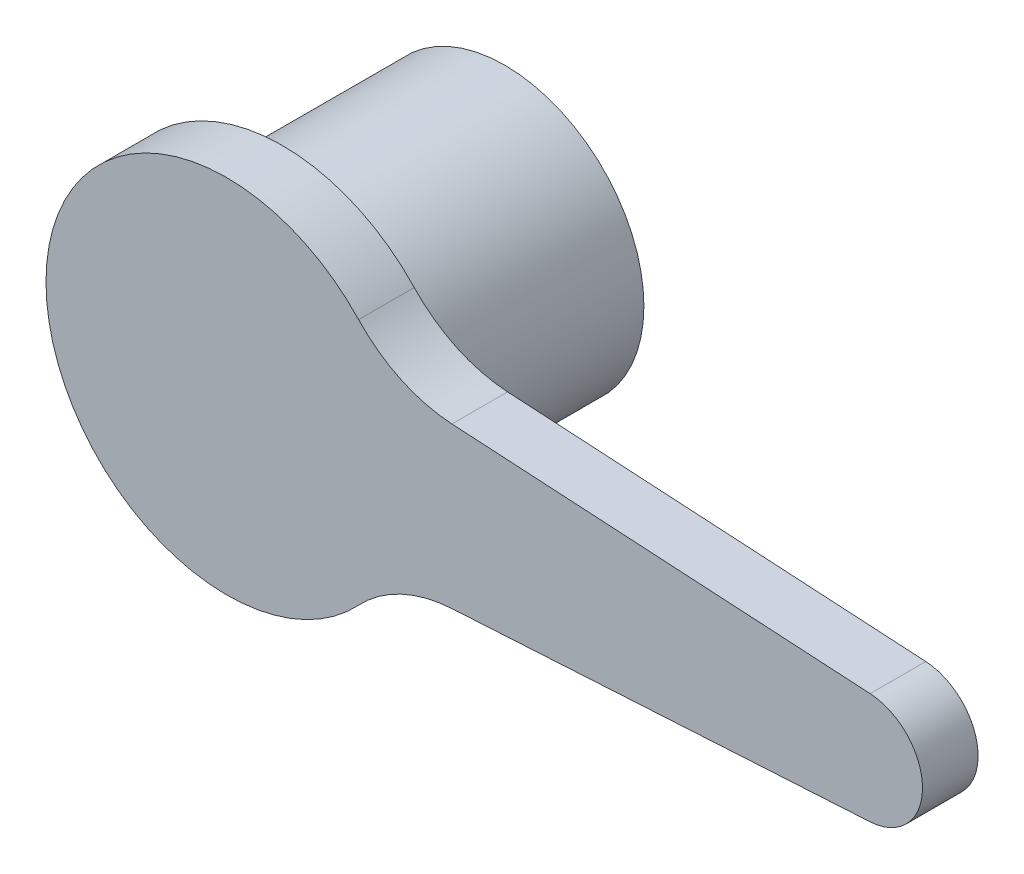
ISO-10303-21;
HEADER;
FILE_DESCRIPTION(('STEP AP214'),'2;1');
FILE_NAME('part.step','',(''),(''),'','','');
FILE_SCHEMA(('AUTOMOTIVE_DESIGN { 1 0 10303 214 1 1 1 1 }'));
ENDSEC;
DATA;
#1=APPLICATION_CONTEXT('core data for automotive mechanical design processes');
#2=APPLICATION_PROTOCOL_DEFINITION('international standard','automotive_design',2000,#1);
#3=PRODUCT_CONTEXT('',#1,'mechanical');
#4=PRODUCT('Part','Part','',(#3));
#5=PRODUCT_RELATED_PRODUCT_CATEGORY('part','',(#4));
#6=PRODUCT_DEFINITION_FORMATION('','',#4);
#7=PRODUCT_DEFINITION_CONTEXT('part definition',#1,'design');
#8=PRODUCT_DEFINITION('design','',#6,#7);
#9=PRODUCT_DEFINITION_SHAPE('','',#8);
#10=(LENGTH_UNIT() NAMED_UNIT(*) SI_UNIT(.MILLI.,.METRE.));
#11=(NAMED_UNIT(*) PLANE_ANGLE_UNIT() SI_UNIT($,.RADIAN.));
#12=(NAMED_UNIT(*) SI_UNIT($,.STERADIAN.) SOLID_ANGLE_UNIT());
#13=UNCERTAINTY_MEASURE_WITH_UNIT(LENGTH_MEASURE(1.E-05),#10,'distance_accuracy_value','');
#14=(GEOMETRIC_REPRESENTATION_CONTEXT(3) GLOBAL_UNCERTAINTY_ASSIGNED_CONTEXT((#13)) GLOBAL_UNIT_ASSIGNED_CONTEXT((#10,
#11,#12)) REPRESENTATION_CONTEXT('',''));
#15=CARTESIAN_POINT('',(0.,0.,0.));
#16=DIRECTION('',(0.,0.,1.));
#17=DIRECTION('',(1.,0.,0.));
#18=AXIS2_PLACEMENT_3D('',#15,#16,#17);
#19=CARTESIAN_POINT('',(230.175921183542,0.,20.));
#20=DIRECTION('',(0.,0.,-1.));
#21=DIRECTION('',(-1.,0.,0.));
#22=AXIS2_PLACEMENT_3D('',#19,#20,#21);
#23=CYLINDRICAL_SURFACE('',#22,20.);
#24=CARTESIAN_POINT('',(230.175921183542,0.,0.));
#25=DIRECTION('',(0.,0.,1.));
#26=DIRECTION('',(1.,0.,0.));
#27=AXIS2_PLACEMENT_3D('',#24,#25,#26);
#28=CIRCLE('',#27,20.);
#29=CARTESIAN_POINT('',(231.342508240109,-19.9659478773098,0.));
#30=VERTEX_POINT('',#29);
#31=CARTESIAN_POINT('',(231.342508240109,19.9659478773098,0.));
#32=VERTEX_POINT('',#31);
#33=EDGE_CURVE('E262',#30,#32,#28,.T.);
#34=ORIENTED_EDGE('',*,*,#33,.T.);
#35=DIRECTION('',(0.,0.,-1.));
#36=VECTOR('',#35,1.);
#37=CARTESIAN_POINT('',(231.342508240109,19.9659478773098,20.));
#38=LINE('',#37,#36);
#39=CARTESIAN_POINT('',(231.342508240109,19.9659478773098,20.));
#40=VERTEX_POINT('',#39);
#41=EDGE_CURVE('E47',#40,#32,#38,.T.);
#42=ORIENTED_EDGE('',*,*,#41,.F.);
#43=CARTESIAN_POINT('',(230.175921183542,0.,20.));
#44=DIRECTION('',(0.,0.,1.));
#45=DIRECTION('',(1.,0.,0.));
#46=AXIS2_PLACEMENT_3D('',#43,#44,#45);
#47=CIRCLE('',#46,20.);
#48=CARTESIAN_POINT('',(231.342508240109,-19.9659478773098,20.));
#49=VERTEX_POINT('',#48);
#50=EDGE_CURVE('E271',#49,#40,#47,.T.);
#51=ORIENTED_EDGE('',*,*,#50,.F.);
#52=DIRECTION('',(0.,0.,-1.));
#53=VECTOR('',#52,1.);
#54=CARTESIAN_POINT('',(231.342508240109,-19.9659478773098,20.));
#55=LINE('',#54,#53);
#56=EDGE_CURVE('E291',#49,#30,#55,.T.);
#57=ORIENTED_EDGE('',*,*,#56,.T.);
#58=EDGE_LOOP('',(#34,#42,#51,#57));
#59=FACE_BOUND('',#58,.T.);
#60=ADVANCED_FACE('F39',(#59),#23,.T.);
#61=CARTESIAN_POINT('',(231.342508240109,19.9659478773098,20.));
#62=DIRECTION('',(-0.0583293528283373,-0.998297393865489,0.));
#63=DIRECTION('',(0.998297393865489,-0.0583293528283373,0.));
#64=AXIS2_PLACEMENT_3D('',#61,#62,#63);
#65=PLANE('',#64);
#66=DIRECTION('',(-0.998297393865489,0.0583293528283373,0.));
#67=VECTOR('',#66,1.);
#68=CARTESIAN_POINT('',(231.342508240109,19.9659478773098,0.));
#69=LINE('',#68,#67);
#70=CARTESIAN_POINT('',(80.9673397628192,28.7521936519975,0.));
#71=VERTEX_POINT('',#70);
#72=EDGE_CURVE('E295',#32,#71,#69,.T.);
#73=ORIENTED_EDGE('',*,*,#72,.T.);
#74=DIRECTION('',(0.,0.,-1.));
#75=VECTOR('',#74,1.);
#76=CARTESIAN_POINT('',(80.9673397628192,28.7521936519975,20.));
#77=LINE('',#76,#75);
#78=CARTESIAN_POINT('',(80.9673397628192,28.7521936519975,20.));
#79=VERTEX_POINT('',#78);
#80=EDGE_CURVE('E324',#79,#71,#77,.T.);
#81=ORIENTED_EDGE('',*,*,#80,.F.);
#82=DIRECTION('',(-0.998297393865489,0.0583293528283373,0.));
#83=VECTOR('',#82,1.);
#84=CARTESIAN_POINT('',(231.342508240109,19.9659478773098,20.));
#85=LINE('',#84,#83);
#86=EDGE_CURVE('E275',#40,#79,#85,.T.);
#87=ORIENTED_EDGE('',*,*,#86,.F.);
#88=ORIENTED_EDGE('',*,*,#41,.T.);
#89=EDGE_LOOP('',(#73,#81,#87,#88));
#90=FACE_BOUND('',#89,.T.);
#91=ADVANCED_FACE('F331',(#90),#65,.F.);
#92=CARTESIAN_POINT('',(83.883807404236,78.667063345272,20.));
#93=DIRECTION('',(0.,0.,-1.));
#94=DIRECTION('',(-1.,0.,0.));
#95=AXIS2_PLACEMENT_3D('',#92,#93,#94);
#96=CYLINDRICAL_SURFACE('',#95,50.);
#97=CARTESIAN_POINT('',(83.883807404236,78.667063345272,0.));
#98=DIRECTION('',(0.,0.,-1.));
#99=DIRECTION('',(-1.,0.,0.));
#100=AXIS2_PLACEMENT_3D('',#97,#98,#99);
#101=CIRCLE('',#100,50.);
#102=CARTESIAN_POINT('',(47.4125867936987,44.4639923255885,0.));
#103=VERTEX_POINT('',#102);
#104=EDGE_CURVE('E298',#71,#103,#101,.T.);
#105=ORIENTED_EDGE('',*,*,#104,.T.);
#106=DIRECTION('',(0.,0.,-1.));
#107=VECTOR('',#106,1.);
#108=CARTESIAN_POINT('',(47.4125867936987,44.4639923255885,20.));
#109=LINE('',#108,#107);
#110=CARTESIAN_POINT('',(47.4125867936987,44.4639923255885,20.));
#111=VERTEX_POINT('',#110);
#112=EDGE_CURVE('E320',#111,#103,#109,.T.);
#113=ORIENTED_EDGE('',*,*,#112,.F.);
#114=CARTESIAN_POINT('',(83.883807404236,78.667063345272,20.));
#115=DIRECTION('',(0.,0.,-1.));
#116=DIRECTION('',(-1.,0.,0.));
#117=AXIS2_PLACEMENT_3D('',#114,#115,#116);
#118=CIRCLE('',#117,50.);
#119=EDGE_CURVE('E279',#79,#111,#118,.T.);
#120=ORIENTED_EDGE('',*,*,#119,.F.);
#121=ORIENTED_EDGE('',*,*,#80,.T.);
#122=EDGE_LOOP('',(#105,#113,#120,#121));
#123=FACE_BOUND('',#122,.T.);
#124=ADVANCED_FACE('F345',(#123),#96,.F.);
#125=CARTESIAN_POINT('',(0.,0.,20.));
#126=DIRECTION('',(0.,0.,-1.));
#127=DIRECTION('',(-1.,0.,0.));
#128=AXIS2_PLACEMENT_3D('',#125,#126,#127);
#129=CYLINDRICAL_SURFACE('',#128,65.);
#130=CARTESIAN_POINT('',(0.,0.,0.));
#131=DIRECTION('',(0.,0.,1.));
#132=DIRECTION('',(1.,0.,0.));
#133=AXIS2_PLACEMENT_3D('',#130,#131,#132);
#134=CIRCLE('',#133,65.);
#135=CARTESIAN_POINT('',(47.4125867936986,-44.4639923255885,0.));
#136=VERTEX_POINT('',#135);
#137=EDGE_CURVE('E301',#103,#136,#134,.T.);
#138=ORIENTED_EDGE('',*,*,#137,.T.);
#139=DIRECTION('',(0.,0.,-1.));
#140=VECTOR('',#139,1.);
#141=CARTESIAN_POINT('',(47.4125867936986,-44.4639923255885,20.));
#142=LINE('',#141,#140);
#143=CARTESIAN_POINT('',(47.4125867936986,-44.4639923255885,20.));
#144=VERTEX_POINT('',#143);
#145=EDGE_CURVE('E316',#144,#136,#142,.T.);
#146=ORIENTED_EDGE('',*,*,#145,.F.);
#147=CARTESIAN_POINT('',(0.,0.,20.));
#148=DIRECTION('',(0.,0.,1.));
#149=DIRECTION('',(1.,0.,0.));
#150=AXIS2_PLACEMENT_3D('',#147,#148,#149);
#151=CIRCLE('',#150,65.);
#152=EDGE_CURVE('E282',#111,#144,#151,.T.);
#153=ORIENTED_EDGE('',*,*,#152,.F.);
#154=ORIENTED_EDGE('',*,*,#112,.T.);
#155=EDGE_LOOP('',(#138,#146,#153,#154));
#156=FACE_BOUND('',#155,.T.);
#157=ADVANCED_FACE('F349',(#156),#129,.T.);
#158=CARTESIAN_POINT('',(83.883807404236,-78.667063345272,20.));
#159=DIRECTION('',(0.,0.,-1.));
#160=DIRECTION('',(-1.,0.,0.));
#161=AXIS2_PLACEMENT_3D('',#158,#159,#160);
#162=CYLINDRICAL_SURFACE('',#161,50.);
#163=CARTESIAN_POINT('',(83.883807404236,-78.667063345272,0.));
#164=DIRECTION('',(0.,0.,-1.));
#165=DIRECTION('',(1.,0.,0.));
#166=AXIS2_PLACEMENT_3D('',#163,#164,#165);
#167=CIRCLE('',#166,50.);
#168=CARTESIAN_POINT('',(80.9673397628192,-28.7521936519975,0.));
#169=VERTEX_POINT('',#168);
#170=EDGE_CURVE('E304',#136,#169,#167,.T.);
#171=ORIENTED_EDGE('',*,*,#170,.T.);
#172=DIRECTION('',(0.,0.,-1.));
#173=VECTOR('',#172,1.);
#174=CARTESIAN_POINT('',(80.9673397628192,-28.7521936519975,20.));
#175=LINE('',#174,#173);
#176=CARTESIAN_POINT('',(80.9673397628192,-28.7521936519975,20.));
#177=VERTEX_POINT('',#176);
#178=EDGE_CURVE('E312',#177,#169,#175,.T.);
#179=ORIENTED_EDGE('',*,*,#178,.F.);
#180=CARTESIAN_POINT('',(83.883807404236,-78.667063345272,20.));
#181=DIRECTION('',(0.,0.,-1.));
#182=DIRECTION('',(1.,0.,0.));
#183=AXIS2_PLACEMENT_3D('',#180,#181,#182);
#184=CIRCLE('',#183,50.);
#185=EDGE_CURVE('E285',#144,#177,#184,.T.);
#186=ORIENTED_EDGE('',*,*,#185,.F.);
#187=ORIENTED_EDGE('',*,*,#145,.T.);
#188=EDGE_LOOP('',(#171,#179,#186,#187));
#189=FACE_BOUND('',#188,.T.);
#190=ADVANCED_FACE('F359',(#189),#162,.F.);
#191=CARTESIAN_POINT('',(231.342508240109,-19.9659478773098,20.));
#192=DIRECTION('',(-0.0583293528283373,0.998297393865489,0.));
#193=DIRECTION('',(-0.998297393865489,-0.0583293528283373,0.));
#194=AXIS2_PLACEMENT_3D('',#191,#192,#193);
#195=PLANE('',#194);
#196=DIRECTION('',(0.998297393865489,0.0583293528283373,0.));
#197=VECTOR('',#196,1.);
#198=CARTESIAN_POINT('',(231.342508240109,-19.9659478773098,0.));
#199=LINE('',#198,#197);
#200=EDGE_CURVE('E276',#169,#30,#199,.T.);
#201=ORIENTED_EDGE('',*,*,#200,.T.);
#202=ORIENTED_EDGE('',*,*,#56,.F.);
#203=DIRECTION('',(0.998297393865489,0.0583293528283373,0.));
#204=VECTOR('',#203,1.);
#205=CARTESIAN_POINT('',(231.342508240109,-19.9659478773098,20.));
#206=LINE('',#205,#204);
#207=EDGE_CURVE('E288',#177,#49,#206,.T.);
#208=ORIENTED_EDGE('',*,*,#207,.F.);
#209=ORIENTED_EDGE('',*,*,#178,.T.);
#210=EDGE_LOOP('',(#201,#202,#208,#209));
#211=FACE_BOUND('',#210,.T.);
#212=ADVANCED_FACE('F357',(#211),#195,.F.);
#213=CARTESIAN_POINT('',(230.175921183542,0.,20.));
#214=DIRECTION('',(0.,0.,1.));
#215=DIRECTION('',(1.,0.,0.));
#216=AXIS2_PLACEMENT_3D('',#213,#214,#215);
#217=PLANE('',#216);
#218=ORIENTED_EDGE('',*,*,#50,.T.);
#219=ORIENTED_EDGE('',*,*,#86,.T.);
#220=ORIENTED_EDGE('',*,*,#119,.T.);
#221=ORIENTED_EDGE('',*,*,#152,.T.);
#222=ORIENTED_EDGE('',*,*,#185,.T.);
#223=ORIENTED_EDGE('',*,*,#207,.T.);
#224=EDGE_LOOP('',(#218,#219,#220,#221,#222,#223));
#225=FACE_BOUND('',#224,.T.);
#226=ADVANCED_FACE('F353',(#225),#217,.T.);
#227=CARTESIAN_POINT('',(230.175921183542,0.,0.));
#228=DIRECTION('',(0.,0.,1.));
#229=DIRECTION('',(1.,0.,0.));
#230=AXIS2_PLACEMENT_3D('',#227,#228,#229);
#231=PLANE('',#230);
#232=CARTESIAN_POINT('',(0.,0.,0.));
#233=DIRECTION('',(0.,0.,1.));
#234=DIRECTION('',(1.,0.,0.));
#235=AXIS2_PLACEMENT_3D('',#232,#233,#234);
#236=CIRCLE('',#235,50.);
#237=CARTESIAN_POINT('',(50.,0.,0.));
#238=VERTEX_POINT('',#237);
#239=EDGE_CURVE('E11',#238,#238,#236,.F.);
#240=ORIENTED_EDGE('',*,*,#239,.F.);
#241=EDGE_LOOP('',(#240));
#242=FACE_BOUND('',#241,.T.);
#243=DIRECTION('',(-0.995379028358009,-0.0960239027798052,0.));
#244=VECTOR('',#243,1.);
#245=CARTESIAN_POINT('',(231.376219968289,-12.4422378544751,0.));
#246=LINE('',#245,#244);
#247=CARTESIAN_POINT('',(231.376219968289,-12.4422378544751,0.));
#248=VERTEX_POINT('',#247);
#249=CARTESIAN_POINT('',(102.400597569495,-24.8844757089502,0.));
#250=VERTEX_POINT('',#249);
#251=EDGE_CURVE('E248',#248,#250,#246,.T.);
#252=ORIENTED_EDGE('',*,*,#251,.F.);
#253=CARTESIAN_POINT('',(230.175921183542,0.,0.));
#254=DIRECTION('',(0.,0.,-1.));
#255=DIRECTION('',(-1.,0.,0.));
#256=AXIS2_PLACEMENT_3D('',#253,#254,#255);
#257=CIRCLE('',#256,12.5);
#258=CARTESIAN_POINT('',(231.376219968289,12.4422378544751,0.));
#259=VERTEX_POINT('',#258);
#260=EDGE_CURVE('E62',#259,#248,#257,.T.);
#261=ORIENTED_EDGE('',*,*,#260,.F.);
#262=DIRECTION('',(0.995379028358009,-0.0960239027798052,0.));
#263=VECTOR('',#262,1.);
#264=CARTESIAN_POINT('',(231.376219968289,12.4422378544751,0.));
#265=LINE('',#264,#263);
#266=CARTESIAN_POINT('',(102.400597569495,24.8844757089502,0.));
#267=VERTEX_POINT('',#266);
#268=EDGE_CURVE('E233',#267,#259,#265,.T.);
#269=ORIENTED_EDGE('',*,*,#268,.F.);
#270=CARTESIAN_POINT('',(100.,0.,0.));
#271=DIRECTION('',(0.,0.,-1.));
#272=DIRECTION('',(-1.,0.,0.));
#273=AXIS2_PLACEMENT_3D('',#270,#271,#272);
#274=CIRCLE('',#273,25.);
#275=EDGE_CURVE('E252',#250,#267,#274,.T.);
#276=ORIENTED_EDGE('',*,*,#275,.F.);
#277=EDGE_LOOP('',(#252,#261,#269,#276));
#278=FACE_BOUND('',#277,.T.);
#279=ORIENTED_EDGE('',*,*,#33,.F.);
#280=ORIENTED_EDGE('',*,*,#200,.F.);
#281=ORIENTED_EDGE('',*,*,#170,.F.);
#282=ORIENTED_EDGE('',*,*,#137,.F.);
#283=ORIENTED_EDGE('',*,*,#104,.F.);
#284=ORIENTED_EDGE('',*,*,#72,.F.);
#285=EDGE_LOOP('',(#279,#280,#281,#282,#283,#284));
#286=FACE_BOUND('',#285,.T.);
#287=ADVANCED_FACE('F339',(#242,#278,#286),#231,.F.);
#288=CARTESIAN_POINT('',(230.175921183542,0.,10.));
#289=DIRECTION('',(0.,0.,-1.));
#290=DIRECTION('',(-1.,0.,0.));
#291=AXIS2_PLACEMENT_3D('',#288,#289,#290);
#292=CYLINDRICAL_SURFACE('',#291,12.5);
#293=ORIENTED_EDGE('',*,*,#260,.T.);
#294=DIRECTION('',(0.,0.,-1.));
#295=VECTOR('',#294,1.);
#296=CARTESIAN_POINT('',(231.376219968289,-12.4422378544751,10.));
#297=LINE('',#296,#295);
#298=CARTESIAN_POINT('',(231.376219968289,-12.4422378544751,10.));
#299=VERTEX_POINT('',#298);
#300=EDGE_CURVE('E245',#299,#248,#297,.T.);
#301=ORIENTED_EDGE('',*,*,#300,.F.);
#302=CARTESIAN_POINT('',(230.175921183542,0.,10.));
#303=DIRECTION('',(0.,0.,-1.));
#304=DIRECTION('',(-1.,0.,0.));
#305=AXIS2_PLACEMENT_3D('',#302,#303,#304);
#306=CIRCLE('',#305,12.5);
#307=CARTESIAN_POINT('',(231.376219968289,12.4422378544751,10.));
#308=VERTEX_POINT('',#307);
#309=EDGE_CURVE('E228',#308,#299,#306,.T.);
#310=ORIENTED_EDGE('',*,*,#309,.F.);
#311=DIRECTION('',(0.,0.,-1.));
#312=VECTOR('',#311,1.);
#313=CARTESIAN_POINT('',(231.376219968289,12.4422378544751,10.));
#314=LINE('',#313,#312);
#315=EDGE_CURVE('E259',#308,#259,#314,.T.);
#316=ORIENTED_EDGE('',*,*,#315,.T.);
#317=EDGE_LOOP('',(#293,#301,#310,#316));
#318=FACE_BOUND('',#317,.T.);
#319=ADVANCED_FACE('F407',(#318),#292,.F.);
#320=CARTESIAN_POINT('',(231.376219968289,12.4422378544751,10.));
#321=DIRECTION('',(0.0960239027798052,0.995379028358009,0.));
#322=DIRECTION('',(-0.995379028358009,0.0960239027798052,0.));
#323=AXIS2_PLACEMENT_3D('',#320,#321,#322);
#324=PLANE('',#323);
#325=ORIENTED_EDGE('',*,*,#268,.T.);
#326=ORIENTED_EDGE('',*,*,#315,.F.);
#327=DIRECTION('',(0.995379028358009,-0.0960239027798052,0.));
#328=VECTOR('',#327,1.);
#329=CARTESIAN_POINT('',(231.376219968289,12.4422378544751,10.));
#330=LINE('',#329,#328);
#331=CARTESIAN_POINT('',(102.400597569495,24.8844757089502,10.));
#332=VERTEX_POINT('',#331);
#333=EDGE_CURVE('E241',#332,#308,#330,.T.);
#334=ORIENTED_EDGE('',*,*,#333,.F.);
#335=DIRECTION('',(0.,0.,-1.));
#336=VECTOR('',#335,1.);
#337=CARTESIAN_POINT('',(102.400597569495,24.8844757089502,10.));
#338=LINE('',#337,#336);
#339=EDGE_CURVE('E263',#332,#267,#338,.T.);
#340=ORIENTED_EDGE('',*,*,#339,.T.);
#341=EDGE_LOOP('',(#325,#326,#334,#340));
#342=FACE_BOUND('',#341,.T.);
#343=ADVANCED_FACE('F412',(#342),#324,.F.);
#344=CARTESIAN_POINT('',(100.,0.,10.));
#345=DIRECTION('',(0.,0.,-1.));
#346=DIRECTION('',(-1.,0.,0.));
#347=AXIS2_PLACEMENT_3D('',#344,#345,#346);
#348=CYLINDRICAL_SURFACE('',#347,25.);
#349=ORIENTED_EDGE('',*,*,#275,.T.);
#350=ORIENTED_EDGE('',*,*,#339,.F.);
#351=CARTESIAN_POINT('',(100.,0.,10.));
#352=DIRECTION('',(0.,0.,-1.));
#353=DIRECTION('',(-1.,0.,0.));
#354=AXIS2_PLACEMENT_3D('',#351,#352,#353);
#355=CIRCLE('',#354,25.);
#356=CARTESIAN_POINT('',(102.400597569495,-24.8844757089502,10.));
#357=VERTEX_POINT('',#356);
#358=EDGE_CURVE('E237',#357,#332,#355,.T.);
#359=ORIENTED_EDGE('',*,*,#358,.F.);
#360=DIRECTION('',(0.,0.,-1.));
#361=VECTOR('',#360,1.);
#362=CARTESIAN_POINT('',(102.400597569495,-24.8844757089502,10.));
#363=LINE('',#362,#361);
#364=EDGE_CURVE('E266',#357,#250,#363,.T.);
#365=ORIENTED_EDGE('',*,*,#364,.T.);
#366=EDGE_LOOP('',(#349,#350,#359,#365));
#367=FACE_BOUND('',#366,.T.);
#368=ADVANCED_FACE('F421',(#367),#348,.F.);
#369=CARTESIAN_POINT('',(231.376219968289,-12.4422378544751,10.));
#370=DIRECTION('',(0.0960239027798052,-0.995379028358009,0.));
#371=DIRECTION('',(0.995379028358009,0.0960239027798052,0.));
#372=AXIS2_PLACEMENT_3D('',#369,#370,#371);
#373=PLANE('',#372);
#374=ORIENTED_EDGE('',*,*,#251,.T.);
#375=ORIENTED_EDGE('',*,*,#364,.F.);
#376=DIRECTION('',(-0.995379028358009,-0.0960239027798052,0.));
#377=VECTOR('',#376,1.);
#378=CARTESIAN_POINT('',(231.376219968289,-12.4422378544751,10.));
#379=LINE('',#378,#377);
#380=EDGE_CURVE('E232',#299,#357,#379,.T.);
#381=ORIENTED_EDGE('',*,*,#380,.F.);
#382=ORIENTED_EDGE('',*,*,#300,.T.);
#383=EDGE_LOOP('',(#374,#375,#381,#382));
#384=FACE_BOUND('',#383,.T.);
#385=ADVANCED_FACE('F431',(#384),#373,.F.);
#386=CARTESIAN_POINT('',(230.175921183542,0.,10.));
#387=DIRECTION('',(0.,0.,-1.));
#388=DIRECTION('',(-1.,0.,0.));
#389=AXIS2_PLACEMENT_3D('',#386,#387,#388);
#390=PLANE('',#389);
#391=ORIENTED_EDGE('',*,*,#309,.T.);
#392=ORIENTED_EDGE('',*,*,#380,.T.);
#393=ORIENTED_EDGE('',*,*,#358,.T.);
#394=ORIENTED_EDGE('',*,*,#333,.T.);
#395=EDGE_LOOP('',(#391,#392,#393,#394));
#396=FACE_BOUND('',#395,.T.);
#397=ADVANCED_FACE('F441',(#396),#390,.T.);
#398=CARTESIAN_POINT('',(0.,0.,-80.));
#399=DIRECTION('',(0.,0.,1.));
#400=DIRECTION('',(1.,0.,0.));
#401=AXIS2_PLACEMENT_3D('',#398,#399,#400);
#402=CYLINDRICAL_SURFACE('',#401,50.);
#403=CARTESIAN_POINT('',(0.,0.,-80.));
#404=DIRECTION('',(0.,0.,-1.));
#405=DIRECTION('',(-1.,0.,0.));
#406=AXIS2_PLACEMENT_3D('',#403,#404,#405);
#407=CIRCLE('',#406,50.);
#408=CARTESIAN_POINT('',(-50.,0.,-80.));
#409=VERTEX_POINT('',#408);
#410=EDGE_CURVE('E213',#409,#409,#407,.T.);
#411=ORIENTED_EDGE('',*,*,#410,.F.);
#412=EDGE_LOOP('',(#411));
#413=FACE_BOUND('',#412,.T.);
#414=ORIENTED_EDGE('',*,*,#239,.T.);
#415=EDGE_LOOP('',(#414));
#416=FACE_BOUND('',#415,.T.);
#417=ADVANCED_FACE('F451',(#413,#416),#402,.T.);
#418=CARTESIAN_POINT('',(0.,0.,-80.));
#419=DIRECTION('',(0.,0.,-1.));
#420=DIRECTION('',(-1.,0.,0.));
#421=AXIS2_PLACEMENT_3D('',#418,#419,#420);
#422=PLANE('',#421);
#423=DIRECTION('',(0.866025403784439,0.5,0.));
#424=VECTOR('',#423,1.);
#425=CARTESIAN_POINT('',(-39.9999999999999,23.094010767585,-80.));
#426=LINE('',#425,#424);
#427=CARTESIAN_POINT('',(-39.9999999999999,23.094010767585,-80.));
#428=VERTEX_POINT('',#427);
#429=CARTESIAN_POINT('',(0.,46.18802153517,-80.));
#430=VERTEX_POINT('',#429);
#431=EDGE_CURVE('E54',#428,#430,#426,.T.);
#432=ORIENTED_EDGE('',*,*,#431,.F.);
#433=DIRECTION('',(0.,1.,0.));
#434=VECTOR('',#433,1.);
#435=CARTESIAN_POINT('',(-39.9999999999999,-23.094010767585,-80.));
#436=LINE('',#435,#434);
#437=CARTESIAN_POINT('',(-39.9999999999999,-23.094010767585,-80.));
#438=VERTEX_POINT('',#437);
#439=EDGE_CURVE('E176',#438,#428,#436,.T.);
#440=ORIENTED_EDGE('',*,*,#439,.F.);
#441=DIRECTION('',(-0.866025403784439,0.5,0.));
#442=VECTOR('',#441,1.);
#443=CARTESIAN_POINT('',(0.,-46.18802153517,-80.));
#444=LINE('',#443,#442);
#445=CARTESIAN_POINT('',(0.,-46.18802153517,-80.));
#446=VERTEX_POINT('',#445);
#447=EDGE_CURVE('E180',#446,#438,#444,.T.);
#448=ORIENTED_EDGE('',*,*,#447,.F.);
#449=DIRECTION('',(-0.866025403784438,-0.5,0.));
#450=VECTOR('',#449,1.);
#451=CARTESIAN_POINT('',(39.9999999999999,-23.094010767585,-80.));
#452=LINE('',#451,#450);
#453=CARTESIAN_POINT('',(39.9999999999999,-23.094010767585,-80.));
#454=VERTEX_POINT('',#453);
#455=EDGE_CURVE('E203',#454,#446,#452,.T.);
#456=ORIENTED_EDGE('',*,*,#455,.F.);
#457=DIRECTION('',(0.,-1.,0.));
#458=VECTOR('',#457,1.);
#459=CARTESIAN_POINT('',(39.9999999999999,23.094010767585,-80.));
#460=LINE('',#459,#458);
#461=CARTESIAN_POINT('',(39.9999999999999,23.094010767585,-80.));
#462=VERTEX_POINT('',#461);
#463=EDGE_CURVE('E199',#462,#454,#460,.T.);
#464=ORIENTED_EDGE('',*,*,#463,.F.);
#465=DIRECTION('',(0.866025403784439,-0.5,0.));
#466=VECTOR('',#465,1.);
#467=CARTESIAN_POINT('',(0.,46.18802153517,-80.));
#468=LINE('',#467,#466);
#469=EDGE_CURVE('E196',#430,#462,#468,.T.);
#470=ORIENTED_EDGE('',*,*,#469,.F.);
#471=EDGE_LOOP('',(#432,#440,#448,#456,#464,#470));
#472=FACE_BOUND('',#471,.T.);
#473=ORIENTED_EDGE('',*,*,#410,.T.);
#474=EDGE_LOOP('',(#473));
#475=FACE_BOUND('',#474,.T.);
#476=ADVANCED_FACE('F468',(#472,#475),#422,.T.);
#477=CARTESIAN_POINT('',(-39.9999999999999,23.094010767585,-5.));
#478=DIRECTION('',(-0.5,0.866025403784439,0.));
#479=DIRECTION('',(-0.866025403784439,-0.5,0.));
#480=AXIS2_PLACEMENT_3D('',#477,#478,#479);
#481=PLANE('',#480);
#482=ORIENTED_EDGE('',*,*,#431,.T.);
#483=DIRECTION('',(0.,0.,-1.));
#484=VECTOR('',#483,1.);
#485=CARTESIAN_POINT('',(0.,46.18802153517,-5.));
#486=LINE('',#485,#484);
#487=CARTESIAN_POINT('',(0.,46.18802153517,-5.));
#488=VERTEX_POINT('',#487);
#489=EDGE_CURVE('E150',#488,#430,#486,.T.);
#490=ORIENTED_EDGE('',*,*,#489,.F.);
#491=DIRECTION('',(0.866025403784439,0.5,0.));
#492=VECTOR('',#491,1.);
#493=CARTESIAN_POINT('',(-39.9999999999999,23.094010767585,-5.));
#494=LINE('',#493,#492);
#495=CARTESIAN_POINT('',(-39.9999999999999,23.094010767585,-5.));
#496=VERTEX_POINT('',#495);
#497=EDGE_CURVE('E154',#496,#488,#494,.T.);
#498=ORIENTED_EDGE('',*,*,#497,.F.);
#499=DIRECTION('',(0.,0.,-1.));
#500=VECTOR('',#499,1.);
#501=CARTESIAN_POINT('',(-39.9999999999999,23.094010767585,-5.));
#502=LINE('',#501,#500);
#503=EDGE_CURVE('E210',#496,#428,#502,.T.);
#504=ORIENTED_EDGE('',*,*,#503,.T.);
#505=EDGE_LOOP('',(#482,#490,#498,#504));
#506=FACE_BOUND('',#505,.T.);
#507=ADVANCED_FACE('F152',(#506),#481,.F.);
#508=CARTESIAN_POINT('',(-39.9999999999999,-23.094010767585,-5.));
#509=DIRECTION('',(-1.,0.,0.));
#510=DIRECTION('',(0.,0.,1.));
#511=AXIS2_PLACEMENT_3D('',#508,#509,#510);
#512=PLANE('',#511);
#513=ORIENTED_EDGE('',*,*,#439,.T.);
#514=ORIENTED_EDGE('',*,*,#503,.F.);
#515=DIRECTION('',(0.,1.,0.));
#516=VECTOR('',#515,1.);
#517=CARTESIAN_POINT('',(-39.9999999999999,-23.094010767585,-5.));
#518=LINE('',#517,#516);
#519=CARTESIAN_POINT('',(-39.9999999999999,-23.094010767585,-5.));
#520=VERTEX_POINT('',#519);
#521=EDGE_CURVE('E161',#520,#496,#518,.T.);
#522=ORIENTED_EDGE('',*,*,#521,.F.);
#523=DIRECTION('',(0.,0.,-1.));
#524=VECTOR('',#523,1.);
#525=CARTESIAN_POINT('',(-39.9999999999999,-23.094010767585,-5.));
#526=LINE('',#525,#524);
#527=EDGE_CURVE('E214',#520,#438,#526,.T.);
#528=ORIENTED_EDGE('',*,*,#527,.T.);
#529=EDGE_LOOP('',(#513,#514,#522,#528));
#530=FACE_BOUND('',#529,.T.);
#531=ADVANCED_FACE('F487',(#530),#512,.F.);
#532=CARTESIAN_POINT('',(0.,-46.18802153517,-5.));
#533=DIRECTION('',(-0.5,-0.866025403784439,0.));
#534=DIRECTION('',(0.866025403784439,-0.5,0.));
#535=AXIS2_PLACEMENT_3D('',#532,#533,#534);
#536=PLANE('',#535);
#537=ORIENTED_EDGE('',*,*,#447,.T.);
#538=ORIENTED_EDGE('',*,*,#527,.F.);
#539=DIRECTION('',(-0.866025403784439,0.5,0.));
#540=VECTOR('',#539,1.);
#541=CARTESIAN_POINT('',(0.,-46.18802153517,-5.));
#542=LINE('',#541,#540);
#543=CARTESIAN_POINT('',(0.,-46.18802153517,-5.));
#544=VERTEX_POINT('',#543);
#545=EDGE_CURVE('E189',#544,#520,#542,.T.);
#546=ORIENTED_EDGE('',*,*,#545,.F.);
#547=DIRECTION('',(0.,0.,-1.));
#548=VECTOR('',#547,1.);
#549=CARTESIAN_POINT('',(0.,-46.18802153517,-5.));
#550=LINE('',#549,#548);
#551=EDGE_CURVE('E217',#544,#446,#550,.T.);
#552=ORIENTED_EDGE('',*,*,#551,.T.);
#553=EDGE_LOOP('',(#537,#538,#546,#552));
#554=FACE_BOUND('',#553,.T.);
#555=ADVANCED_FACE('F496',(#554),#536,.F.);
#556=CARTESIAN_POINT('',(39.9999999999999,-23.094010767585,-5.));
#557=DIRECTION('',(0.5,-0.866025403784438,0.));
#558=DIRECTION('',(0.866025403784439,0.5,0.));
#559=AXIS2_PLACEMENT_3D('',#556,#557,#558);
#560=PLANE('',#559);
#561=ORIENTED_EDGE('',*,*,#455,.T.);
#562=ORIENTED_EDGE('',*,*,#551,.F.);
#563=DIRECTION('',(-0.866025403784438,-0.5,0.));
#564=VECTOR('',#563,1.);
#565=CARTESIAN_POINT('',(39.9999999999999,-23.094010767585,-5.));
#566=LINE('',#565,#564);
#567=CARTESIAN_POINT('',(39.9999999999999,-23.094010767585,-5.));
#568=VERTEX_POINT('',#567);
#569=EDGE_CURVE('E185',#568,#544,#566,.T.);
#570=ORIENTED_EDGE('',*,*,#569,.F.);
#571=DIRECTION('',(0.,0.,-1.));
#572=VECTOR('',#571,1.);
#573=CARTESIAN_POINT('',(39.9999999999999,-23.094010767585,-5.));
#574=LINE('',#573,#572);
#575=EDGE_CURVE('E220',#568,#454,#574,.T.);
#576=ORIENTED_EDGE('',*,*,#575,.T.);
#577=EDGE_LOOP('',(#561,#562,#570,#576));
#578=FACE_BOUND('',#577,.T.);
#579=ADVANCED_FACE('F506',(#578),#560,.F.);
#580=CARTESIAN_POINT('',(39.9999999999999,23.094010767585,-5.));
#581=DIRECTION('',(1.,0.,0.));
#582=DIRECTION('',(0.,0.,-1.));
#583=AXIS2_PLACEMENT_3D('',#580,#581,#582);
#584=PLANE('',#583);
#585=ORIENTED_EDGE('',*,*,#463,.T.);
#586=ORIENTED_EDGE('',*,*,#575,.F.);
#587=DIRECTION('',(0.,-1.,0.));
#588=VECTOR('',#587,1.);
#589=CARTESIAN_POINT('',(39.9999999999999,23.094010767585,-5.));
#590=LINE('',#589,#588);
#591=CARTESIAN_POINT('',(39.9999999999999,23.094010767585,-5.));
#592=VERTEX_POINT('',#591);
#593=EDGE_CURVE('E170',#592,#568,#590,.T.);
#594=ORIENTED_EDGE('',*,*,#593,.F.);
#595=DIRECTION('',(0.,0.,-1.));
#596=VECTOR('',#595,1.);
#597=CARTESIAN_POINT('',(39.9999999999999,23.094010767585,-5.));
#598=LINE('',#597,#596);
#599=EDGE_CURVE('E160',#592,#462,#598,.T.);
#600=ORIENTED_EDGE('',*,*,#599,.T.);
#601=EDGE_LOOP('',(#585,#586,#594,#600));
#602=FACE_BOUND('',#601,.T.);
#603=ADVANCED_FACE('F516',(#602),#584,.F.);
#604=CARTESIAN_POINT('',(0.,46.18802153517,-5.));
#605=DIRECTION('',(0.5,0.866025403784439,0.));
#606=DIRECTION('',(-0.866025403784439,0.5,0.));
#607=AXIS2_PLACEMENT_3D('',#604,#605,#606);
#608=PLANE('',#607);
#609=ORIENTED_EDGE('',*,*,#469,.T.);
#610=ORIENTED_EDGE('',*,*,#599,.F.);
#611=DIRECTION('',(0.866025403784439,-0.5,0.));
#612=VECTOR('',#611,1.);
#613=CARTESIAN_POINT('',(0.,46.18802153517,-5.));
#614=LINE('',#613,#612);
#615=EDGE_CURVE('E164',#488,#592,#614,.T.);
#616=ORIENTED_EDGE('',*,*,#615,.F.);
#617=ORIENTED_EDGE('',*,*,#489,.T.);
#618=EDGE_LOOP('',(#609,#610,#616,#617));
#619=FACE_BOUND('',#618,.T.);
#620=ADVANCED_FACE('F165',(#619),#608,.F.);
#621=CARTESIAN_POINT('',(0.,0.,-5.));
#622=DIRECTION('',(0.,0.,-1.));
#623=DIRECTION('',(-1.,0.,0.));
#624=AXIS2_PLACEMENT_3D('',#621,#622,#623);
#625=PLANE('',#624);
#626=ORIENTED_EDGE('',*,*,#497,.T.);
#627=ORIENTED_EDGE('',*,*,#615,.T.);
#628=ORIENTED_EDGE('',*,*,#593,.T.);
#629=ORIENTED_EDGE('',*,*,#569,.T.);
#630=ORIENTED_EDGE('',*,*,#545,.T.);
#631=ORIENTED_EDGE('',*,*,#521,.T.);
#632=EDGE_LOOP('',(#626,#627,#628,#629,#630,#631));
#633=FACE_BOUND('',#632,.T.);
#634=ADVANCED_FACE('F172',(#633),#625,.T.);
#635=CLOSED_SHELL('',(#60,#91,#124,#157,#190,#212,#226,#287,#319,#343,#368,#385,#397,#417,#476,
#507,#531,#555,#579,#603,#620,#634));
#636=MANIFOLD_SOLID_BREP('B2',#635);
#637=ADVANCED_BREP_SHAPE_REPRESENTATION('',(#18,#636),#14);
#638=SHAPE_DEFINITION_REPRESENTATION(#9,#637);
ENDSEC;
END-ISO-10303-21;
